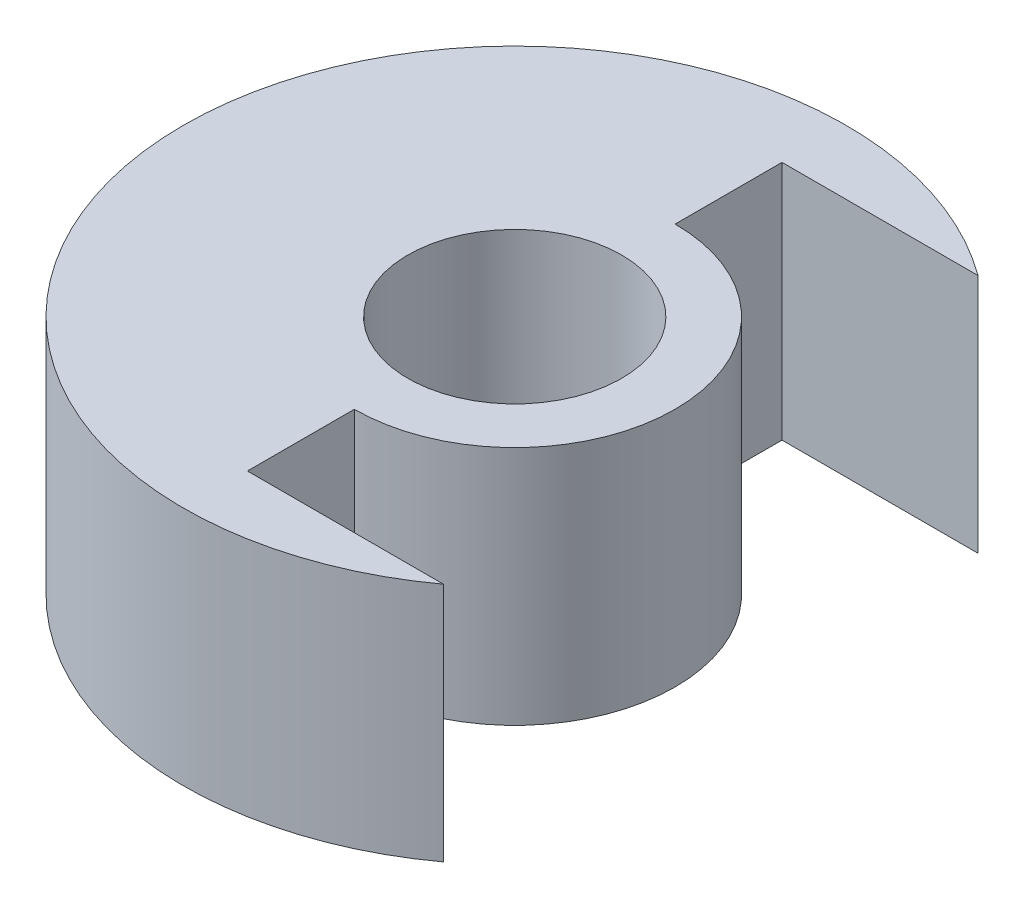
ISO-10303-21;
HEADER;
FILE_DESCRIPTION(('STEP AP214'),'2;1');
FILE_NAME('part.step','',(''),(''),'','','');
FILE_SCHEMA(('AUTOMOTIVE_DESIGN { 1 0 10303 214 1 1 1 1 }'));
ENDSEC;
DATA;
#1=APPLICATION_CONTEXT('core data for automotive mechanical design processes');
#2=APPLICATION_PROTOCOL_DEFINITION('international standard','automotive_design',2000,#1);
#3=PRODUCT_CONTEXT('',#1,'mechanical');
#4=PRODUCT('Part','Part','',(#3));
#5=PRODUCT_RELATED_PRODUCT_CATEGORY('part','',(#4));
#6=PRODUCT_DEFINITION_FORMATION('','',#4);
#7=PRODUCT_DEFINITION_CONTEXT('part definition',#1,'design');
#8=PRODUCT_DEFINITION('design','',#6,#7);
#9=PRODUCT_DEFINITION_SHAPE('','',#8);
#10=(LENGTH_UNIT() NAMED_UNIT(*) SI_UNIT(.MILLI.,.METRE.));
#11=(NAMED_UNIT(*) PLANE_ANGLE_UNIT() SI_UNIT($,.RADIAN.));
#12=(NAMED_UNIT(*) SI_UNIT($,.STERADIAN.) SOLID_ANGLE_UNIT());
#13=UNCERTAINTY_MEASURE_WITH_UNIT(LENGTH_MEASURE(1.E-05),#10,'distance_accuracy_value','');
#14=(GEOMETRIC_REPRESENTATION_CONTEXT(3) GLOBAL_UNCERTAINTY_ASSIGNED_CONTEXT((#13)) GLOBAL_UNIT_ASSIGNED_CONTEXT((#10,
#11,#12)) REPRESENTATION_CONTEXT('',''));
#15=CARTESIAN_POINT('',(0.,0.,0.));
#16=DIRECTION('',(0.,0.,1.));
#17=DIRECTION('',(1.,0.,0.));
#18=AXIS2_PLACEMENT_3D('',#15,#16,#17);
#19=CARTESIAN_POINT('',(0.,45.,0.));
#20=DIRECTION('',(0.,-1.,0.));
#21=DIRECTION('',(0.,0.,-1.));
#22=AXIS2_PLACEMENT_3D('',#19,#20,#21);
#23=CYLINDRICAL_SURFACE('',#22,62.);
#24=CARTESIAN_POINT('',(0.,0.,0.));
#25=DIRECTION('',(0.,1.,0.));
#26=DIRECTION('',(0.,0.,1.));
#27=AXIS2_PLACEMENT_3D('',#24,#25,#26);
#28=CIRCLE('',#27,62.);
#29=CARTESIAN_POINT('',(36.6606055596467,0.,-50.));
#30=VERTEX_POINT('',#29);
#31=CARTESIAN_POINT('',(36.6606055596467,0.,50.));
#32=VERTEX_POINT('',#31);
#33=EDGE_CURVE('E44',#30,#32,#28,.T.);
#34=ORIENTED_EDGE('',*,*,#33,.T.);
#35=DIRECTION('',(0.,-1.,0.));
#36=VECTOR('',#35,1.);
#37=CARTESIAN_POINT('',(36.6606055596467,45.,50.));
#38=LINE('',#37,#36);
#39=CARTESIAN_POINT('',(36.6606055596467,45.,50.));
#40=VERTEX_POINT('',#39);
#41=EDGE_CURVE('E96',#40,#32,#38,.T.);
#42=ORIENTED_EDGE('',*,*,#41,.F.);
#43=CARTESIAN_POINT('',(0.,45.,0.));
#44=DIRECTION('',(0.,1.,0.));
#45=DIRECTION('',(0.,0.,1.));
#46=AXIS2_PLACEMENT_3D('',#43,#44,#45);
#47=CIRCLE('',#46,62.);
#48=CARTESIAN_POINT('',(36.6606055596467,45.,-50.));
#49=VERTEX_POINT('',#48);
#50=EDGE_CURVE('E11',#49,#40,#47,.T.);
#51=ORIENTED_EDGE('',*,*,#50,.F.);
#52=DIRECTION('',(0.,-1.,0.));
#53=VECTOR('',#52,1.);
#54=CARTESIAN_POINT('',(36.6606055596467,45.,-50.));
#55=LINE('',#54,#53);
#56=EDGE_CURVE('E109',#49,#30,#55,.T.);
#57=ORIENTED_EDGE('',*,*,#56,.T.);
#58=EDGE_LOOP('',(#34,#42,#51,#57));
#59=FACE_BOUND('',#58,.T.);
#60=ADVANCED_FACE('F36',(#59),#23,.T.);
#61=CARTESIAN_POINT('',(0.,45.,0.));
#62=DIRECTION('',(0.,1.,0.));
#63=DIRECTION('',(0.,0.,1.));
#64=AXIS2_PLACEMENT_3D('',#61,#62,#63);
#65=PLANE('',#64);
#66=DIRECTION('',(-1.,0.,0.));
#67=VECTOR('',#66,1.);
#68=CARTESIAN_POINT('',(0.,45.,50.));
#69=LINE('',#68,#67);
#70=CARTESIAN_POINT('',(0.,45.,50.));
#71=VERTEX_POINT('',#70);
#72=EDGE_CURVE('E92',#40,#71,#69,.T.);
#73=ORIENTED_EDGE('',*,*,#72,.T.);
#74=DIRECTION('',(0.,0.,-1.));
#75=VECTOR('',#74,1.);
#76=CARTESIAN_POINT('',(0.,45.,30.));
#77=LINE('',#76,#75);
#78=CARTESIAN_POINT('',(0.,45.,30.));
#79=VERTEX_POINT('',#78);
#80=EDGE_CURVE('E101',#71,#79,#77,.T.);
#81=ORIENTED_EDGE('',*,*,#80,.T.);
#82=CARTESIAN_POINT('',(0.,45.,0.));
#83=DIRECTION('',(0.,1.,0.));
#84=DIRECTION('',(0.,0.,-1.));
#85=AXIS2_PLACEMENT_3D('',#82,#83,#84);
#86=CIRCLE('',#85,30.);
#87=CARTESIAN_POINT('',(0.,45.,-30.));
#88=VERTEX_POINT('',#87);
#89=EDGE_CURVE('E120',#79,#88,#86,.T.);
#90=ORIENTED_EDGE('',*,*,#89,.T.);
#91=DIRECTION('',(0.,0.,-1.));
#92=VECTOR('',#91,1.);
#93=CARTESIAN_POINT('',(0.,45.,-30.));
#94=LINE('',#93,#92);
#95=CARTESIAN_POINT('',(0.,45.,-50.));
#96=VERTEX_POINT('',#95);
#97=EDGE_CURVE('E117',#88,#96,#94,.T.);
#98=ORIENTED_EDGE('',*,*,#97,.T.);
#99=DIRECTION('',(1.,0.,0.));
#100=VECTOR('',#99,1.);
#101=CARTESIAN_POINT('',(0.,45.,-50.));
#102=LINE('',#101,#100);
#103=EDGE_CURVE('E102',#96,#49,#102,.T.);
#104=ORIENTED_EDGE('',*,*,#103,.T.);
#105=ORIENTED_EDGE('',*,*,#50,.T.);
#106=EDGE_LOOP('',(#73,#81,#90,#98,#104,#105));
#107=FACE_BOUND('',#106,.T.);
#108=CARTESIAN_POINT('',(0.,45.,0.));
#109=DIRECTION('',(0.,-1.,0.));
#110=DIRECTION('',(0.,0.,-1.));
#111=AXIS2_PLACEMENT_3D('',#108,#109,#110);
#112=CIRCLE('',#111,20.);
#113=CARTESIAN_POINT('',(0.,45.,-20.));
#114=VERTEX_POINT('',#113);
#115=EDGE_CURVE('E136',#114,#114,#112,.T.);
#116=ORIENTED_EDGE('',*,*,#115,.T.);
#117=EDGE_LOOP('',(#116));
#118=FACE_BOUND('',#117,.T.);
#119=ADVANCED_FACE('F112',(#107,#118),#65,.T.);
#120=CARTESIAN_POINT('',(0.,0.,0.));
#121=DIRECTION('',(0.,1.,0.));
#122=DIRECTION('',(0.,0.,1.));
#123=AXIS2_PLACEMENT_3D('',#120,#121,#122);
#124=PLANE('',#123);
#125=CARTESIAN_POINT('',(0.,0.,0.));
#126=DIRECTION('',(0.,-1.,0.));
#127=DIRECTION('',(0.,0.,-1.));
#128=AXIS2_PLACEMENT_3D('',#125,#126,#127);
#129=CIRCLE('',#128,23.5);
#130=CARTESIAN_POINT('',(0.,0.,-23.5));
#131=VERTEX_POINT('',#130);
#132=EDGE_CURVE('E147',#131,#131,#129,.T.);
#133=ORIENTED_EDGE('',*,*,#132,.F.);
#134=EDGE_LOOP('',(#133));
#135=FACE_BOUND('',#134,.T.);
#136=DIRECTION('',(0.,0.,-1.));
#137=VECTOR('',#136,1.);
#138=CARTESIAN_POINT('',(0.,0.,30.));
#139=LINE('',#138,#137);
#140=CARTESIAN_POINT('',(0.,0.,50.));
#141=VERTEX_POINT('',#140);
#142=CARTESIAN_POINT('',(0.,0.,30.));
#143=VERTEX_POINT('',#142);
#144=EDGE_CURVE('E133',#141,#143,#139,.T.);
#145=ORIENTED_EDGE('',*,*,#144,.F.);
#146=DIRECTION('',(-1.,0.,0.));
#147=VECTOR('',#146,1.);
#148=CARTESIAN_POINT('',(0.,0.,50.));
#149=LINE('',#148,#147);
#150=EDGE_CURVE('E131',#32,#141,#149,.T.);
#151=ORIENTED_EDGE('',*,*,#150,.F.);
#152=ORIENTED_EDGE('',*,*,#33,.F.);
#153=DIRECTION('',(1.,0.,0.));
#154=VECTOR('',#153,1.);
#155=CARTESIAN_POINT('',(0.,0.,-50.));
#156=LINE('',#155,#154);
#157=CARTESIAN_POINT('',(0.,0.,-50.));
#158=VERTEX_POINT('',#157);
#159=EDGE_CURVE('E129',#158,#30,#156,.T.);
#160=ORIENTED_EDGE('',*,*,#159,.F.);
#161=DIRECTION('',(0.,0.,-1.));
#162=VECTOR('',#161,1.);
#163=CARTESIAN_POINT('',(0.,0.,-30.));
#164=LINE('',#163,#162);
#165=CARTESIAN_POINT('',(0.,0.,-30.));
#166=VERTEX_POINT('',#165);
#167=EDGE_CURVE('E126',#166,#158,#164,.T.);
#168=ORIENTED_EDGE('',*,*,#167,.F.);
#169=CARTESIAN_POINT('',(0.,0.,0.));
#170=DIRECTION('',(0.,1.,0.));
#171=DIRECTION('',(0.,0.,-1.));
#172=AXIS2_PLACEMENT_3D('',#169,#170,#171);
#173=CIRCLE('',#172,30.);
#174=EDGE_CURVE('E52',#143,#166,#173,.T.);
#175=ORIENTED_EDGE('',*,*,#174,.F.);
#176=EDGE_LOOP('',(#145,#151,#152,#160,#168,#175));
#177=FACE_BOUND('',#176,.T.);
#178=ADVANCED_FACE('F165',(#135,#177),#124,.F.);
#179=CARTESIAN_POINT('',(0.,8.,0.));
#180=DIRECTION('',(0.,-1.,0.));
#181=DIRECTION('',(0.,0.,-1.));
#182=AXIS2_PLACEMENT_3D('',#179,#180,#181);
#183=CYLINDRICAL_SURFACE('',#182,23.5);
#184=CARTESIAN_POINT('',(0.,8.,0.));
#185=DIRECTION('',(0.,-1.,0.));
#186=DIRECTION('',(0.,0.,-1.));
#187=AXIS2_PLACEMENT_3D('',#184,#185,#186);
#188=CIRCLE('',#187,23.5);
#189=CARTESIAN_POINT('',(0.,8.,-23.5));
#190=VERTEX_POINT('',#189);
#191=EDGE_CURVE('E144',#190,#190,#188,.T.);
#192=ORIENTED_EDGE('',*,*,#191,.F.);
#193=EDGE_LOOP('',(#192));
#194=FACE_BOUND('',#193,.T.);
#195=ORIENTED_EDGE('',*,*,#132,.T.);
#196=EDGE_LOOP('',(#195));
#197=FACE_BOUND('',#196,.T.);
#198=ADVANCED_FACE('F160',(#194,#197),#183,.F.);
#199=CARTESIAN_POINT('',(0.,8.,0.));
#200=DIRECTION('',(0.,-1.,0.));
#201=DIRECTION('',(0.,0.,-1.));
#202=AXIS2_PLACEMENT_3D('',#199,#200,#201);
#203=PLANE('',#202);
#204=CARTESIAN_POINT('',(0.,8.,0.));
#205=DIRECTION('',(0.,-1.,0.));
#206=DIRECTION('',(0.,0.,-1.));
#207=AXIS2_PLACEMENT_3D('',#204,#205,#206);
#208=CIRCLE('',#207,20.);
#209=CARTESIAN_POINT('',(0.,8.,-20.));
#210=VERTEX_POINT('',#209);
#211=EDGE_CURVE('E39',#210,#210,#208,.T.);
#212=ORIENTED_EDGE('',*,*,#211,.F.);
#213=EDGE_LOOP('',(#212));
#214=FACE_BOUND('',#213,.T.);
#215=ORIENTED_EDGE('',*,*,#191,.T.);
#216=EDGE_LOOP('',(#215));
#217=FACE_BOUND('',#216,.T.);
#218=ADVANCED_FACE('F157',(#214,#217),#203,.T.);
#219=CARTESIAN_POINT('',(0.,45.,0.));
#220=DIRECTION('',(0.,-1.,0.));
#221=DIRECTION('',(0.,0.,-1.));
#222=AXIS2_PLACEMENT_3D('',#219,#220,#221);
#223=CYLINDRICAL_SURFACE('',#222,20.);
#224=CARTESIAN_POINT('',(0.,8.,-20.));
#225=CARTESIAN_POINT('',(0.,8.38541666666667,-20.));
#226=CARTESIAN_POINT('',(0.,8.77083333333333,-20.));
#227=CARTESIAN_POINT('',(0.,9.54166666666667,-20.));
#228=CARTESIAN_POINT('',(0.,9.92708333333333,-20.));
#229=CARTESIAN_POINT('',(0.,10.6979166666667,-20.));
#230=CARTESIAN_POINT('',(0.,11.0833333333333,-20.));
#231=CARTESIAN_POINT('',(0.,11.8541666666667,-20.));
#232=CARTESIAN_POINT('',(0.,12.2395833333333,-20.));
#233=CARTESIAN_POINT('',(0.,13.0104166666667,-20.));
#234=CARTESIAN_POINT('',(0.,13.3958333333333,-20.));
#235=CARTESIAN_POINT('',(0.,14.1666666666667,-20.));
#236=CARTESIAN_POINT('',(0.,14.5520833333333,-20.));
#237=CARTESIAN_POINT('',(0.,15.3229166666667,-20.));
#238=CARTESIAN_POINT('',(0.,15.7083333333333,-20.));
#239=CARTESIAN_POINT('',(0.,16.4791666666667,-20.));
#240=CARTESIAN_POINT('',(0.,16.8645833333333,-20.));
#241=CARTESIAN_POINT('',(0.,17.6354166666667,-20.));
#242=CARTESIAN_POINT('',(0.,18.0208333333333,-20.));
#243=CARTESIAN_POINT('',(0.,18.7916666666667,-20.));
#244=CARTESIAN_POINT('',(0.,19.1770833333333,-20.));
#245=CARTESIAN_POINT('',(0.,19.9479166666667,-20.));
#246=CARTESIAN_POINT('',(0.,20.3333333333333,-20.));
#247=CARTESIAN_POINT('',(0.,21.1041666666667,-20.));
#248=CARTESIAN_POINT('',(0.,21.4895833333333,-20.));
#249=CARTESIAN_POINT('',(0.,22.2604166666667,-20.));
#250=CARTESIAN_POINT('',(0.,22.6458333333333,-20.));
#251=CARTESIAN_POINT('',(0.,23.4166666666667,-20.));
#252=CARTESIAN_POINT('',(0.,23.8020833333333,-20.));
#253=CARTESIAN_POINT('',(0.,24.5729166666667,-20.));
#254=CARTESIAN_POINT('',(0.,24.9583333333333,-20.));
#255=CARTESIAN_POINT('',(0.,25.7291666666667,-20.));
#256=CARTESIAN_POINT('',(0.,26.1145833333333,-20.));
#257=CARTESIAN_POINT('',(0.,26.8854166666667,-20.));
#258=CARTESIAN_POINT('',(0.,27.2708333333333,-20.));
#259=CARTESIAN_POINT('',(0.,28.0416666666667,-20.));
#260=CARTESIAN_POINT('',(0.,28.4270833333333,-20.));
#261=CARTESIAN_POINT('',(0.,29.1979166666667,-20.));
#262=CARTESIAN_POINT('',(0.,29.5833333333333,-20.));
#263=CARTESIAN_POINT('',(0.,30.3541666666667,-20.));
#264=CARTESIAN_POINT('',(0.,30.7395833333333,-20.));
#265=CARTESIAN_POINT('',(0.,31.5104166666667,-20.));
#266=CARTESIAN_POINT('',(0.,31.8958333333333,-20.));
#267=CARTESIAN_POINT('',(0.,32.6666666666667,-20.));
#268=CARTESIAN_POINT('',(0.,33.0520833333333,-20.));
#269=CARTESIAN_POINT('',(0.,33.8229166666667,-20.));
#270=CARTESIAN_POINT('',(0.,34.2083333333333,-20.));
#271=CARTESIAN_POINT('',(0.,34.9791666666667,-20.));
#272=CARTESIAN_POINT('',(0.,35.3645833333333,-20.));
#273=CARTESIAN_POINT('',(0.,36.1354166666667,-20.));
#274=CARTESIAN_POINT('',(0.,36.5208333333333,-20.));
#275=CARTESIAN_POINT('',(0.,37.2916666666667,-20.));
#276=CARTESIAN_POINT('',(0.,37.6770833333333,-20.));
#277=CARTESIAN_POINT('',(0.,38.4479166666667,-20.));
#278=CARTESIAN_POINT('',(0.,38.8333333333333,-20.));
#279=CARTESIAN_POINT('',(0.,39.6041666666667,-20.));
#280=CARTESIAN_POINT('',(0.,39.9895833333333,-20.));
#281=CARTESIAN_POINT('',(0.,40.7604166666667,-20.));
#282=CARTESIAN_POINT('',(0.,41.1458333333333,-20.));
#283=CARTESIAN_POINT('',(0.,41.9166666666667,-20.));
#284=CARTESIAN_POINT('',(0.,42.3020833333333,-20.));
#285=CARTESIAN_POINT('',(0.,43.0729166666667,-20.));
#286=CARTESIAN_POINT('',(0.,43.4583333333333,-20.));
#287=CARTESIAN_POINT('',(0.,44.2291666666667,-20.));
#288=CARTESIAN_POINT('',(0.,44.6145833333333,-20.));
#289=CARTESIAN_POINT('',(0.,45.,-20.));
#290=B_SPLINE_CURVE_WITH_KNOTS('',3,(#224,#225,#226,#227,#228,#229,#230,#231,#232,#233,#234,
#235,#236,#237,#238,#239,#240,#241,#242,#243,#244,#245,#246,#247,#248,#249,#250,#251,#252,#253,
#254,#255,#256,#257,#258,#259,#260,#261,#262,#263,#264,#265,#266,#267,#268,#269,#270,#271,#272,
#273,#274,#275,#276,#277,#278,#279,#280,#281,#282,#283,#284,#285,#286,#287,#288,#289),
.UNSPECIFIED.,.F.,.F.,(4,2,2,2,2,2,2,2,2,2,2,2,2,2,2,2,2,2,2,2,2,2,2,2,2,2,2,2,2,2,2,2,4),(0.,
1.15625,2.3125,3.46875,4.625,5.78125,6.9375,8.09375,9.25,10.40625,11.5625,12.71875,13.875,
15.03125,16.1875,17.34375,18.5,19.65625,20.8125,21.96875,23.125,24.28125,25.4375,26.59375,27.75,
28.90625,30.0625,31.21875,32.375,33.53125,34.6875,35.84375,37.),.UNSPECIFIED.);
#291=EDGE_CURVE('BSEAM154',#210,#114,#290,.T.);
#292=ORIENTED_EDGE('',*,*,#211,.T.);
#293=ORIENTED_EDGE('',*,*,#115,.F.);
#294=ORIENTED_EDGE('',*,*,#291,.T.);
#295=ORIENTED_EDGE('',*,*,#291,.F.);
#296=EDGE_LOOP('',(#292,#294,#293,#295));
#297=FACE_BOUND('',#296,.T.);
#298=ADVANCED_FACE('F154',(#297),#223,.F.);
#299=CARTESIAN_POINT('',(0.,45.,0.));
#300=DIRECTION('',(0.,-1.,0.));
#301=DIRECTION('',(0.,0.,-1.));
#302=AXIS2_PLACEMENT_3D('',#299,#300,#301);
#303=CYLINDRICAL_SURFACE('',#302,30.);
#304=ORIENTED_EDGE('',*,*,#174,.T.);
#305=DIRECTION('',(0.,-1.,0.));
#306=VECTOR('',#305,1.);
#307=CARTESIAN_POINT('',(0.,45.,-30.));
#308=LINE('',#307,#306);
#309=EDGE_CURVE('E82',#88,#166,#308,.T.);
#310=ORIENTED_EDGE('',*,*,#309,.F.);
#311=ORIENTED_EDGE('',*,*,#89,.F.);
#312=DIRECTION('',(0.,-1.,0.));
#313=VECTOR('',#312,1.);
#314=CARTESIAN_POINT('',(0.,45.,30.));
#315=LINE('',#314,#313);
#316=EDGE_CURVE('E60',#79,#143,#315,.T.);
#317=ORIENTED_EDGE('',*,*,#316,.T.);
#318=EDGE_LOOP('',(#304,#310,#311,#317));
#319=FACE_BOUND('',#318,.T.);
#320=ADVANCED_FACE('F188',(#319),#303,.T.);
#321=CARTESIAN_POINT('',(0.,45.,30.));
#322=DIRECTION('',(-1.,0.,0.));
#323=DIRECTION('',(0.,0.,1.));
#324=AXIS2_PLACEMENT_3D('',#321,#322,#323);
#325=PLANE('',#324);
#326=ORIENTED_EDGE('',*,*,#144,.T.);
#327=ORIENTED_EDGE('',*,*,#316,.F.);
#328=ORIENTED_EDGE('',*,*,#80,.F.);
#329=DIRECTION('',(0.,-1.,0.));
#330=VECTOR('',#329,1.);
#331=CARTESIAN_POINT('',(0.,45.,50.));
#332=LINE('',#331,#330);
#333=EDGE_CURVE('E98',#71,#141,#332,.T.);
#334=ORIENTED_EDGE('',*,*,#333,.T.);
#335=EDGE_LOOP('',(#326,#327,#328,#334));
#336=FACE_BOUND('',#335,.T.);
#337=ADVANCED_FACE('F193',(#336),#325,.F.);
#338=CARTESIAN_POINT('',(0.,45.,50.));
#339=DIRECTION('',(0.,0.,1.));
#340=DIRECTION('',(1.,0.,0.));
#341=AXIS2_PLACEMENT_3D('',#338,#339,#340);
#342=PLANE('',#341);
#343=ORIENTED_EDGE('',*,*,#150,.T.);
#344=ORIENTED_EDGE('',*,*,#333,.F.);
#345=ORIENTED_EDGE('',*,*,#72,.F.);
#346=ORIENTED_EDGE('',*,*,#41,.T.);
#347=EDGE_LOOP('',(#343,#344,#345,#346));
#348=FACE_BOUND('',#347,.T.);
#349=ADVANCED_FACE('F95',(#348),#342,.F.);
#350=CARTESIAN_POINT('',(0.,45.,-50.));
#351=DIRECTION('',(0.,0.,-1.));
#352=DIRECTION('',(-1.,0.,0.));
#353=AXIS2_PLACEMENT_3D('',#350,#351,#352);
#354=PLANE('',#353);
#355=ORIENTED_EDGE('',*,*,#159,.T.);
#356=ORIENTED_EDGE('',*,*,#56,.F.);
#357=ORIENTED_EDGE('',*,*,#103,.F.);
#358=DIRECTION('',(0.,-1.,0.));
#359=VECTOR('',#358,1.);
#360=CARTESIAN_POINT('',(0.,45.,-50.));
#361=LINE('',#360,#359);
#362=EDGE_CURVE('E139',#96,#158,#361,.T.);
#363=ORIENTED_EDGE('',*,*,#362,.T.);
#364=EDGE_LOOP('',(#355,#356,#357,#363));
#365=FACE_BOUND('',#364,.T.);
#366=ADVANCED_FACE('F212',(#365),#354,.F.);
#367=CARTESIAN_POINT('',(0.,45.,-30.));
#368=DIRECTION('',(-1.,0.,0.));
#369=DIRECTION('',(0.,0.,1.));
#370=AXIS2_PLACEMENT_3D('',#367,#368,#369);
#371=PLANE('',#370);
#372=ORIENTED_EDGE('',*,*,#167,.T.);
#373=ORIENTED_EDGE('',*,*,#362,.F.);
#374=ORIENTED_EDGE('',*,*,#97,.F.);
#375=ORIENTED_EDGE('',*,*,#309,.T.);
#376=EDGE_LOOP('',(#372,#373,#374,#375));
#377=FACE_BOUND('',#376,.T.);
#378=ADVANCED_FACE('F221',(#377),#371,.F.);
#379=CLOSED_SHELL('',(#60,#119,#178,#198,#218,#298,#320,#337,#349,#366,#378));
#380=MANIFOLD_SOLID_BREP('B2',#379);
#381=ADVANCED_BREP_SHAPE_REPRESENTATION('',(#18,#380),#14);
#382=SHAPE_DEFINITION_REPRESENTATION(#9,#381);
ENDSEC;
END-ISO-10303-21;
